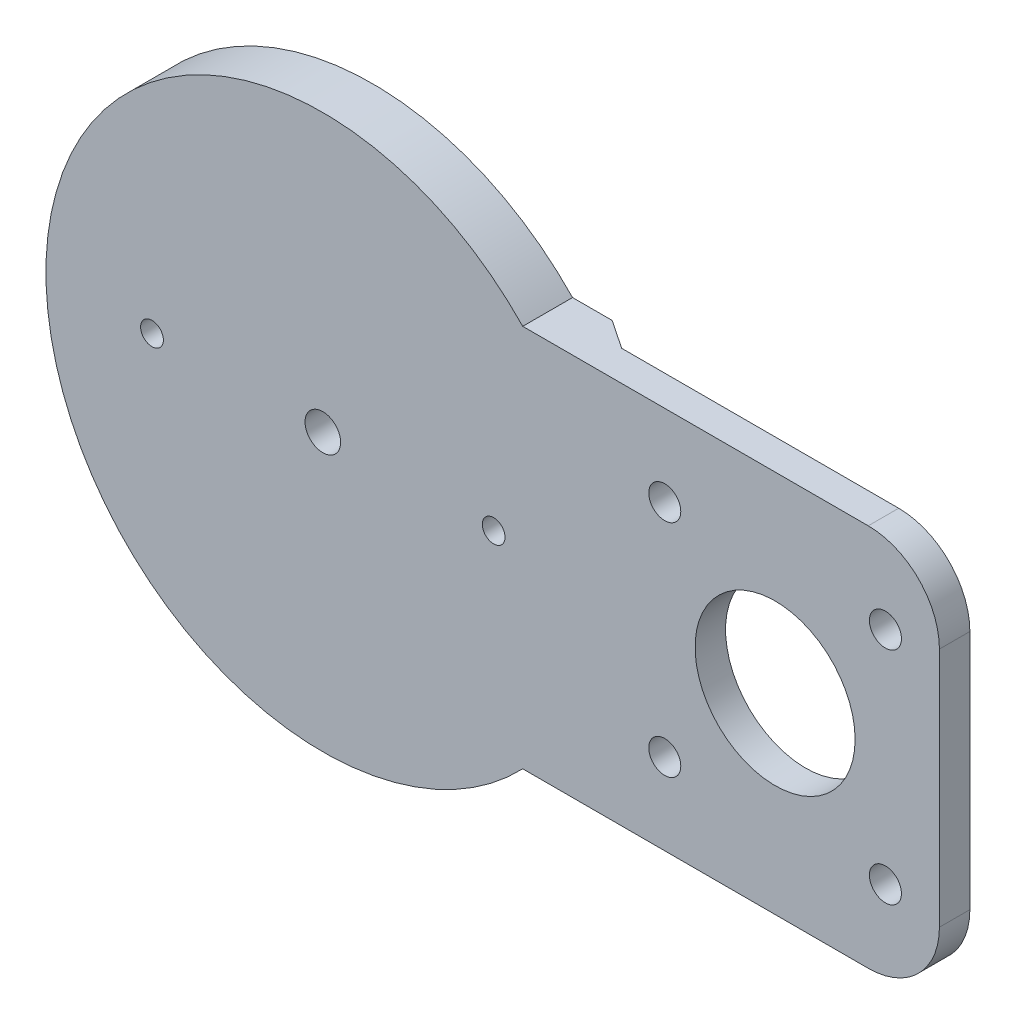
ISO-10303-21;
HEADER;
FILE_DESCRIPTION(('STEP AP214'),'2;1');
FILE_NAME('part.step','',(''),(''),'','','');
FILE_SCHEMA(('AUTOMOTIVE_DESIGN { 1 0 10303 214 1 1 1 1 }'));
ENDSEC;
DATA;
#1=APPLICATION_CONTEXT('core data for automotive mechanical design processes');
#2=APPLICATION_PROTOCOL_DEFINITION('international standard','automotive_design',2000,#1);
#3=PRODUCT_CONTEXT('',#1,'mechanical');
#4=PRODUCT('Part','Part','',(#3));
#5=PRODUCT_RELATED_PRODUCT_CATEGORY('part','',(#4));
#6=PRODUCT_DEFINITION_FORMATION('','',#4);
#7=PRODUCT_DEFINITION_CONTEXT('part definition',#1,'design');
#8=PRODUCT_DEFINITION('design','',#6,#7);
#9=PRODUCT_DEFINITION_SHAPE('','',#8);
#10=(LENGTH_UNIT() NAMED_UNIT(*) SI_UNIT(.MILLI.,.METRE.));
#11=(NAMED_UNIT(*) PLANE_ANGLE_UNIT() SI_UNIT($,.RADIAN.));
#12=(NAMED_UNIT(*) SI_UNIT($,.STERADIAN.) SOLID_ANGLE_UNIT());
#13=UNCERTAINTY_MEASURE_WITH_UNIT(LENGTH_MEASURE(1.E-05),#10,'distance_accuracy_value','');
#14=(GEOMETRIC_REPRESENTATION_CONTEXT(3) GLOBAL_UNCERTAINTY_ASSIGNED_CONTEXT((#13)) GLOBAL_UNIT_ASSIGNED_CONTEXT((#10,
#11,#12)) REPRESENTATION_CONTEXT('',''));
#15=CARTESIAN_POINT('',(0.,0.,0.));
#16=DIRECTION('',(0.,0.,1.));
#17=DIRECTION('',(1.,0.,0.));
#18=AXIS2_PLACEMENT_3D('',#15,#16,#17);
#19=CARTESIAN_POINT('',(0.,0.,0.));
#20=DIRECTION('',(0.,0.,-1.));
#21=DIRECTION('',(-1.,0.,0.));
#22=AXIS2_PLACEMENT_3D('',#19,#20,#21);
#23=PLANE('',#22);
#24=CARTESIAN_POINT('',(-24.,0.,0.));
#25=DIRECTION('',(0.,0.,-1.));
#26=DIRECTION('',(-1.,0.,0.));
#27=AXIS2_PLACEMENT_3D('',#24,#25,#26);
#28=CIRCLE('',#27,1.6);
#29=CARTESIAN_POINT('',(-25.6,0.,0.));
#30=VERTEX_POINT('',#29);
#31=EDGE_CURVE('E172',#30,#30,#28,.F.);
#32=ORIENTED_EDGE('',*,*,#31,.T.);
#33=EDGE_LOOP('',(#32));
#34=FACE_BOUND('',#33,.T.);
#35=CARTESIAN_POINT('',(0.,0.,0.));
#36=DIRECTION('',(0.,0.,-1.));
#37=DIRECTION('',(-1.,0.,0.));
#38=AXIS2_PLACEMENT_3D('',#35,#36,#37);
#39=CIRCLE('',#38,2.5);
#40=CARTESIAN_POINT('',(-2.5,0.,0.));
#41=VERTEX_POINT('',#40);
#42=EDGE_CURVE('E165',#41,#41,#39,.F.);
#43=ORIENTED_EDGE('',*,*,#42,.T.);
#44=EDGE_LOOP('',(#43));
#45=FACE_BOUND('',#44,.T.);
#46=CARTESIAN_POINT('',(24.,0.,0.));
#47=DIRECTION('',(0.,0.,-1.));
#48=DIRECTION('',(-1.,0.,0.));
#49=AXIS2_PLACEMENT_3D('',#46,#47,#48);
#50=CIRCLE('',#49,1.6);
#51=CARTESIAN_POINT('',(22.4,0.,0.));
#52=VERTEX_POINT('',#51);
#53=EDGE_CURVE('E158',#52,#52,#50,.F.);
#54=ORIENTED_EDGE('',*,*,#53,.T.);
#55=EDGE_LOOP('',(#54));
#56=FACE_BOUND('',#55,.T.);
#57=CARTESIAN_POINT('',(0.,0.,0.));
#58=DIRECTION('',(0.,0.,1.));
#59=DIRECTION('',(0.,1.,0.));
#60=AXIS2_PLACEMENT_3D('',#57,#58,#59);
#61=CIRCLE('',#60,27.5);
#62=CARTESIAN_POINT('',(0.,27.5,0.));
#63=VERTEX_POINT('',#62);
#64=EDGE_CURVE('E96',#63,#63,#61,.T.);
#65=ORIENTED_EDGE('',*,*,#64,.F.);
#66=EDGE_LOOP('',(#65));
#67=FACE_BOUND('',#66,.T.);
#68=ADVANCED_FACE('F18',(#34,#45,#56,#67),#23,.T.);
#69=CARTESIAN_POINT('',(37.7110314580561,120.933629388198,2.723));
#70=DIRECTION('',(-0.556254898737596,0.,0.831011725326681));
#71=DIRECTION('',(0.831011725326681,0.,0.556254898737596));
#72=AXIS2_PLACEMENT_3D('',#69,#70,#71);
#73=PLANE('',#72);
#74=CARTESIAN_POINT('',(0.,0.,-22.5196594543477));
#75=DIRECTION('',(-0.556254898737596,0.,0.831011725326681));
#76=DIRECTION('',(-0.831011725326681,0.,-0.556254898737596));
#77=AXIS2_PLACEMENT_3D('',#74,#75,#76);
#78=ELLIPSE('',#77,43.9223646160364,36.5);
#79=CARTESIAN_POINT('',(33.6430314580561,14.1561447545667,0.));
#80=VERTEX_POINT('',#79);
#81=CARTESIAN_POINT('',(33.6430314580561,-14.1561447545667,0.));
#82=VERTEX_POINT('',#81);
#83=EDGE_CURVE('E11',#80,#82,#78,.F.);
#84=ORIENTED_EDGE('',*,*,#83,.F.);
#85=DIRECTION('',(0.,-1.,0.));
#86=VECTOR('',#85,1.);
#87=CARTESIAN_POINT('',(33.6430314580561,120.933629388198,0.));
#88=LINE('',#87,#86);
#89=CARTESIAN_POINT('',(33.6430314580561,26.9205,0.));
#90=VERTEX_POINT('',#89);
#91=EDGE_CURVE('E94',#90,#80,#88,.T.);
#92=ORIENTED_EDGE('',*,*,#91,.F.);
#93=DIRECTION('',(0.831011725326681,0.,0.556254898737596));
#94=VECTOR('',#93,1.);
#95=CARTESIAN_POINT('',(33.0405655096556,26.9205,-0.403273052481443));
#96=LINE('',#95,#94);
#97=CARTESIAN_POINT('',(37.7110314580561,26.9205,2.723));
#98=VERTEX_POINT('',#97);
#99=EDGE_CURVE('E130',#90,#98,#96,.T.);
#100=ORIENTED_EDGE('',*,*,#99,.T.);
#101=DIRECTION('',(0.,-1.,0.));
#102=VECTOR('',#101,1.);
#103=CARTESIAN_POINT('',(37.7110314580561,120.933629388198,2.723));
#104=LINE('',#103,#102);
#105=CARTESIAN_POINT('',(37.7110314580561,-26.9205,2.723));
#106=VERTEX_POINT('',#105);
#107=EDGE_CURVE('E39',#98,#106,#104,.T.);
#108=ORIENTED_EDGE('',*,*,#107,.T.);
#109=DIRECTION('',(-0.831011725326681,0.,-0.556254898737596));
#110=VECTOR('',#109,1.);
#111=CARTESIAN_POINT('',(37.7110314580561,-26.9205,2.723));
#112=LINE('',#111,#110);
#113=CARTESIAN_POINT('',(33.6430314580561,-26.9205,0.));
#114=VERTEX_POINT('',#113);
#115=EDGE_CURVE('E100',#106,#114,#112,.T.);
#116=ORIENTED_EDGE('',*,*,#115,.T.);
#117=EDGE_CURVE('E91',#82,#114,#88,.T.);
#118=ORIENTED_EDGE('',*,*,#117,.F.);
#119=EDGE_LOOP('',(#84,#92,#100,#108,#116,#118));
#120=FACE_BOUND('',#119,.T.);
#121=ADVANCED_FACE('F98',(#120),#73,.F.);
#122=CARTESIAN_POINT('',(28.0850314580561,26.9205,7.));
#123=DIRECTION('',(0.,1.,0.));
#124=DIRECTION('',(0.,0.,1.));
#125=AXIS2_PLACEMENT_3D('',#122,#123,#124);
#126=PLANE('',#125);
#127=DIRECTION('',(1.,0.,0.));
#128=VECTOR('',#127,1.);
#129=CARTESIAN_POINT('',(28.0850314580561,26.9205,2.723));
#130=LINE('',#129,#128);
#131=CARTESIAN_POINT('',(76.6270314580561,26.9205,2.723));
#132=VERTEX_POINT('',#131);
#133=EDGE_CURVE('E126',#98,#132,#130,.T.);
#134=ORIENTED_EDGE('',*,*,#133,.F.);
#135=ORIENTED_EDGE('',*,*,#99,.F.);
#136=DIRECTION('',(1.,0.,0.));
#137=VECTOR('',#136,1.);
#138=CARTESIAN_POINT('',(28.0850314580561,26.9205,0.));
#139=LINE('',#138,#137);
#140=CARTESIAN_POINT('',(28.0850314580561,26.9205,0.));
#141=VERTEX_POINT('',#140);
#142=EDGE_CURVE('E175',#141,#90,#139,.T.);
#143=ORIENTED_EDGE('',*,*,#142,.F.);
#144=DIRECTION('',(0.,0.,-1.));
#145=VECTOR('',#144,1.);
#146=CARTESIAN_POINT('',(28.0850314580561,26.9205,7.));
#147=LINE('',#146,#145);
#148=CARTESIAN_POINT('',(28.0850314580561,26.9205,7.));
#149=VERTEX_POINT('',#148);
#150=EDGE_CURVE('E185',#149,#141,#147,.T.);
#151=ORIENTED_EDGE('',*,*,#150,.F.);
#152=DIRECTION('',(1.,0.,0.));
#153=VECTOR('',#152,1.);
#154=CARTESIAN_POINT('',(28.0850314580561,26.9205,7.));
#155=LINE('',#154,#153);
#156=CARTESIAN_POINT('',(76.6270314580561,26.9205,7.));
#157=VERTEX_POINT('',#156);
#158=EDGE_CURVE('E180',#149,#157,#155,.T.);
#159=ORIENTED_EDGE('',*,*,#158,.T.);
#160=DIRECTION('',(0.,0.,-1.));
#161=VECTOR('',#160,1.);
#162=CARTESIAN_POINT('',(76.6270314580561,26.9205,7.));
#163=LINE('',#162,#161);
#164=EDGE_CURVE('E26',#157,#132,#163,.T.);
#165=ORIENTED_EDGE('',*,*,#164,.T.);
#166=EDGE_LOOP('',(#134,#135,#143,#151,#159,#165));
#167=FACE_BOUND('',#166,.T.);
#168=ADVANCED_FACE('F215',(#167),#126,.T.);
#169=CARTESIAN_POINT('',(86.6270314580561,-26.9205,7.));
#170=DIRECTION('',(1.,0.,0.));
#171=DIRECTION('',(0.,1.,0.));
#172=AXIS2_PLACEMENT_3D('',#169,#170,#171);
#173=PLANE('',#172);
#174=DIRECTION('',(0.,-1.,0.));
#175=VECTOR('',#174,1.);
#176=CARTESIAN_POINT('',(86.6270314580561,120.933629388198,2.723));
#177=LINE('',#176,#175);
#178=CARTESIAN_POINT('',(86.6270314580561,16.9205,2.723));
#179=VERTEX_POINT('',#178);
#180=CARTESIAN_POINT('',(86.6270314580561,-16.9205,2.723));
#181=VERTEX_POINT('',#180);
#182=EDGE_CURVE('E109',#179,#181,#177,.T.);
#183=ORIENTED_EDGE('',*,*,#182,.F.);
#184=DIRECTION('',(0.,0.,-1.));
#185=VECTOR('',#184,1.);
#186=CARTESIAN_POINT('',(86.6270314580561,16.9205,7.));
#187=LINE('',#186,#185);
#188=CARTESIAN_POINT('',(86.6270314580561,16.9205,7.));
#189=VERTEX_POINT('',#188);
#190=EDGE_CURVE('E201',#179,#189,#187,.F.);
#191=ORIENTED_EDGE('',*,*,#190,.T.);
#192=DIRECTION('',(0.,-1.,0.));
#193=VECTOR('',#192,1.);
#194=CARTESIAN_POINT('',(86.6270314580561,26.9205,7.));
#195=LINE('',#194,#193);
#196=CARTESIAN_POINT('',(86.6270314580561,-16.9205,7.));
#197=VERTEX_POINT('',#196);
#198=EDGE_CURVE('E176',#189,#197,#195,.T.);
#199=ORIENTED_EDGE('',*,*,#198,.T.);
#200=DIRECTION('',(0.,0.,-1.));
#201=VECTOR('',#200,1.);
#202=CARTESIAN_POINT('',(86.6270314580561,-16.9205,7.));
#203=LINE('',#202,#201);
#204=EDGE_CURVE('E203',#197,#181,#203,.T.);
#205=ORIENTED_EDGE('',*,*,#204,.T.);
#206=EDGE_LOOP('',(#183,#191,#199,#205));
#207=FACE_BOUND('',#206,.T.);
#208=ADVANCED_FACE('F227',(#207),#173,.T.);
#209=CARTESIAN_POINT('',(28.0850314580561,-26.9205,7.));
#210=DIRECTION('',(0.,-1.,0.));
#211=DIRECTION('',(1.,0.,0.));
#212=AXIS2_PLACEMENT_3D('',#209,#210,#211);
#213=PLANE('',#212);
#214=DIRECTION('',(-1.,0.,0.));
#215=VECTOR('',#214,1.);
#216=CARTESIAN_POINT('',(86.6270314580561,-26.9205,2.723));
#217=LINE('',#216,#215);
#218=CARTESIAN_POINT('',(76.6270314580561,-26.9205,2.723));
#219=VERTEX_POINT('',#218);
#220=EDGE_CURVE('E104',#219,#106,#217,.T.);
#221=ORIENTED_EDGE('',*,*,#220,.F.);
#222=DIRECTION('',(0.,0.,-1.));
#223=VECTOR('',#222,1.);
#224=CARTESIAN_POINT('',(76.6270314580561,-26.9205,7.));
#225=LINE('',#224,#223);
#226=CARTESIAN_POINT('',(76.6270314580561,-26.9205,7.));
#227=VERTEX_POINT('',#226);
#228=EDGE_CURVE('E206',#219,#227,#225,.F.);
#229=ORIENTED_EDGE('',*,*,#228,.T.);
#230=DIRECTION('',(-1.,0.,0.));
#231=VECTOR('',#230,1.);
#232=CARTESIAN_POINT('',(28.0850314580561,-26.9205,7.));
#233=LINE('',#232,#231);
#234=CARTESIAN_POINT('',(28.0850314580561,-26.9205,7.));
#235=VERTEX_POINT('',#234);
#236=EDGE_CURVE('E179',#227,#235,#233,.T.);
#237=ORIENTED_EDGE('',*,*,#236,.T.);
#238=DIRECTION('',(0.,0.,-1.));
#239=VECTOR('',#238,1.);
#240=CARTESIAN_POINT('',(28.0850314580561,-26.9205,7.));
#241=LINE('',#240,#239);
#242=CARTESIAN_POINT('',(28.0850314580561,-26.9205,0.));
#243=VERTEX_POINT('',#242);
#244=EDGE_CURVE('E198',#235,#243,#241,.T.);
#245=ORIENTED_EDGE('',*,*,#244,.T.);
#246=DIRECTION('',(-1.,0.,0.));
#247=VECTOR('',#246,1.);
#248=CARTESIAN_POINT('',(28.0850314580561,-26.9205,0.));
#249=LINE('',#248,#247);
#250=EDGE_CURVE('E189',#114,#243,#249,.T.);
#251=ORIENTED_EDGE('',*,*,#250,.F.);
#252=ORIENTED_EDGE('',*,*,#115,.F.);
#253=EDGE_LOOP('',(#221,#229,#237,#245,#251,#252));
#254=FACE_BOUND('',#253,.T.);
#255=ADVANCED_FACE('F236',(#254),#213,.T.);
#256=CARTESIAN_POINT('',(0.,0.,7.));
#257=DIRECTION('',(0.,0.,-1.));
#258=DIRECTION('',(-1.,0.,0.));
#259=AXIS2_PLACEMENT_3D('',#256,#257,#258);
#260=CYLINDRICAL_SURFACE('',#259,38.9035);
#261=CARTESIAN_POINT('',(0.,0.,0.));
#262=DIRECTION('',(0.,0.,-1.));
#263=DIRECTION('',(1.,0.,0.));
#264=AXIS2_PLACEMENT_3D('',#261,#262,#263);
#265=CIRCLE('',#264,38.9035);
#266=EDGE_CURVE('E188',#243,#141,#265,.T.);
#267=ORIENTED_EDGE('',*,*,#266,.F.);
#268=ORIENTED_EDGE('',*,*,#244,.F.);
#269=CARTESIAN_POINT('',(0.,0.,7.));
#270=DIRECTION('',(0.,0.,-1.));
#271=DIRECTION('',(1.,0.,0.));
#272=AXIS2_PLACEMENT_3D('',#269,#270,#271);
#273=CIRCLE('',#272,38.9035);
#274=EDGE_CURVE('E182',#235,#149,#273,.T.);
#275=ORIENTED_EDGE('',*,*,#274,.T.);
#276=ORIENTED_EDGE('',*,*,#150,.T.);
#277=EDGE_LOOP('',(#267,#268,#275,#276));
#278=FACE_BOUND('',#277,.T.);
#279=ADVANCED_FACE('F283',(#278),#260,.T.);
#280=CARTESIAN_POINT('',(0.,0.,7.));
#281=DIRECTION('',(0.,0.,-1.));
#282=DIRECTION('',(-1.,0.,0.));
#283=AXIS2_PLACEMENT_3D('',#280,#281,#282);
#284=PLANE('',#283);
#285=CARTESIAN_POINT('',(79.0390314580561,15.5,7.));
#286=DIRECTION('',(0.,0.,-1.));
#287=DIRECTION('',(1.,0.,0.));
#288=AXIS2_PLACEMENT_3D('',#285,#286,#287);
#289=CIRCLE('',#288,2.25);
#290=CARTESIAN_POINT('',(81.2890314580561,15.5,7.));
#291=VERTEX_POINT('',#290);
#292=EDGE_CURVE('E132',#291,#291,#289,.T.);
#293=ORIENTED_EDGE('',*,*,#292,.T.);
#294=EDGE_LOOP('',(#293));
#295=FACE_BOUND('',#294,.T.);
#296=CARTESIAN_POINT('',(79.0390314580561,-15.5,7.));
#297=DIRECTION('',(0.,0.,-1.));
#298=DIRECTION('',(1.,0.,0.));
#299=AXIS2_PLACEMENT_3D('',#296,#297,#298);
#300=CIRCLE('',#299,2.25);
#301=CARTESIAN_POINT('',(81.2890314580561,-15.5,7.));
#302=VERTEX_POINT('',#301);
#303=EDGE_CURVE('E138',#302,#302,#300,.T.);
#304=ORIENTED_EDGE('',*,*,#303,.T.);
#305=EDGE_LOOP('',(#304));
#306=FACE_BOUND('',#305,.T.);
#307=CARTESIAN_POINT('',(63.5410314580561,0.,7.));
#308=DIRECTION('',(0.,0.,-1.));
#309=DIRECTION('',(1.,0.,0.));
#310=AXIS2_PLACEMENT_3D('',#307,#308,#309);
#311=CIRCLE('',#310,11.24);
#312=CARTESIAN_POINT('',(74.7810314580561,0.,7.));
#313=VERTEX_POINT('',#312);
#314=EDGE_CURVE('E142',#313,#313,#311,.T.);
#315=ORIENTED_EDGE('',*,*,#314,.T.);
#316=EDGE_LOOP('',(#315));
#317=FACE_BOUND('',#316,.T.);
#318=CARTESIAN_POINT('',(48.0390314580561,-15.5,7.));
#319=DIRECTION('',(0.,0.,-1.));
#320=DIRECTION('',(1.,0.,0.));
#321=AXIS2_PLACEMENT_3D('',#318,#319,#320);
#322=CIRCLE('',#321,2.25);
#323=CARTESIAN_POINT('',(50.2890314580561,-15.5,7.));
#324=VERTEX_POINT('',#323);
#325=EDGE_CURVE('E146',#324,#324,#322,.T.);
#326=ORIENTED_EDGE('',*,*,#325,.T.);
#327=EDGE_LOOP('',(#326));
#328=FACE_BOUND('',#327,.T.);
#329=CARTESIAN_POINT('',(48.0390314580561,15.5,7.));
#330=DIRECTION('',(0.,0.,-1.));
#331=DIRECTION('',(1.,0.,0.));
#332=AXIS2_PLACEMENT_3D('',#329,#330,#331);
#333=CIRCLE('',#332,2.25);
#334=CARTESIAN_POINT('',(50.2890314580561,15.5,7.));
#335=VERTEX_POINT('',#334);
#336=EDGE_CURVE('E150',#335,#335,#333,.T.);
#337=ORIENTED_EDGE('',*,*,#336,.T.);
#338=EDGE_LOOP('',(#337));
#339=FACE_BOUND('',#338,.T.);
#340=CARTESIAN_POINT('',(24.,0.,7.));
#341=DIRECTION('',(0.,0.,-1.));
#342=DIRECTION('',(1.,0.,0.));
#343=AXIS2_PLACEMENT_3D('',#340,#341,#342);
#344=CIRCLE('',#343,1.6);
#345=CARTESIAN_POINT('',(25.6,0.,7.));
#346=VERTEX_POINT('',#345);
#347=EDGE_CURVE('E154',#346,#346,#344,.T.);
#348=ORIENTED_EDGE('',*,*,#347,.T.);
#349=EDGE_LOOP('',(#348));
#350=FACE_BOUND('',#349,.T.);
#351=CARTESIAN_POINT('',(0.,0.,7.));
#352=DIRECTION('',(0.,0.,-1.));
#353=DIRECTION('',(1.,0.,0.));
#354=AXIS2_PLACEMENT_3D('',#351,#352,#353);
#355=CIRCLE('',#354,2.5);
#356=CARTESIAN_POINT('',(2.5,0.,7.));
#357=VERTEX_POINT('',#356);
#358=EDGE_CURVE('E161',#357,#357,#355,.T.);
#359=ORIENTED_EDGE('',*,*,#358,.T.);
#360=EDGE_LOOP('',(#359));
#361=FACE_BOUND('',#360,.T.);
#362=CARTESIAN_POINT('',(-24.,0.,7.));
#363=DIRECTION('',(0.,0.,-1.));
#364=DIRECTION('',(1.,0.,0.));
#365=AXIS2_PLACEMENT_3D('',#362,#363,#364);
#366=CIRCLE('',#365,1.6);
#367=CARTESIAN_POINT('',(-22.4,0.,7.));
#368=VERTEX_POINT('',#367);
#369=EDGE_CURVE('E168',#368,#368,#366,.T.);
#370=ORIENTED_EDGE('',*,*,#369,.T.);
#371=EDGE_LOOP('',(#370));
#372=FACE_BOUND('',#371,.T.);
#373=ORIENTED_EDGE('',*,*,#236,.F.);
#374=CARTESIAN_POINT('',(76.6270314580561,-16.9205,7.));
#375=DIRECTION('',(0.,0.,-1.));
#376=DIRECTION('',(-1.,0.,0.));
#377=AXIS2_PLACEMENT_3D('',#374,#375,#376);
#378=CIRCLE('',#377,10.);
#379=EDGE_CURVE('E210',#227,#197,#378,.F.);
#380=ORIENTED_EDGE('',*,*,#379,.T.);
#381=ORIENTED_EDGE('',*,*,#198,.F.);
#382=CARTESIAN_POINT('',(76.6270314580561,16.9205,7.));
#383=DIRECTION('',(0.,0.,-1.));
#384=DIRECTION('',(-1.,0.,0.));
#385=AXIS2_PLACEMENT_3D('',#382,#383,#384);
#386=CIRCLE('',#385,10.);
#387=EDGE_CURVE('E208',#189,#157,#386,.F.);
#388=ORIENTED_EDGE('',*,*,#387,.T.);
#389=ORIENTED_EDGE('',*,*,#158,.F.);
#390=ORIENTED_EDGE('',*,*,#274,.F.);
#391=EDGE_LOOP('',(#373,#380,#381,#388,#389,#390));
#392=FACE_BOUND('',#391,.T.);
#393=ADVANCED_FACE('F277',(#295,#306,#317,#328,#339,#350,#361,#372,#392),#284,.F.);
#394=ORIENTED_EDGE('',*,*,#91,.T.);
#395=CARTESIAN_POINT('',(0.,0.,0.));
#396=DIRECTION('',(0.,0.,1.));
#397=DIRECTION('',(1.,0.,0.));
#398=AXIS2_PLACEMENT_3D('',#395,#396,#397);
#399=CIRCLE('',#398,36.5);
#400=EDGE_CURVE('E31',#80,#82,#399,.T.);
#401=ORIENTED_EDGE('',*,*,#400,.T.);
#402=ORIENTED_EDGE('',*,*,#117,.T.);
#403=ORIENTED_EDGE('',*,*,#250,.T.);
#404=ORIENTED_EDGE('',*,*,#266,.T.);
#405=ORIENTED_EDGE('',*,*,#142,.T.);
#406=EDGE_LOOP('',(#394,#401,#402,#403,#404,#405));
#407=FACE_BOUND('',#406,.T.);
#408=ADVANCED_FACE('F90',(#407),#23,.T.);
#409=CARTESIAN_POINT('',(76.6270314580561,-16.9205,7.));
#410=DIRECTION('',(0.,0.,-1.));
#411=DIRECTION('',(-1.,0.,0.));
#412=AXIS2_PLACEMENT_3D('',#409,#410,#411);
#413=CYLINDRICAL_SURFACE('',#412,10.);
#414=CARTESIAN_POINT('',(76.6270314580561,-16.9205,2.723));
#415=DIRECTION('',(0.,0.,1.));
#416=DIRECTION('',(1.,0.,0.));
#417=AXIS2_PLACEMENT_3D('',#414,#415,#416);
#418=CIRCLE('',#417,10.);
#419=EDGE_CURVE('E128',#181,#219,#418,.F.);
#420=ORIENTED_EDGE('',*,*,#419,.F.);
#421=ORIENTED_EDGE('',*,*,#204,.F.);
#422=ORIENTED_EDGE('',*,*,#379,.F.);
#423=ORIENTED_EDGE('',*,*,#228,.F.);
#424=EDGE_LOOP('',(#420,#421,#422,#423));
#425=FACE_BOUND('',#424,.T.);
#426=ADVANCED_FACE('F232',(#425),#413,.T.);
#427=CARTESIAN_POINT('',(76.6270314580561,16.9205,7.));
#428=DIRECTION('',(0.,0.,-1.));
#429=DIRECTION('',(-1.,0.,0.));
#430=AXIS2_PLACEMENT_3D('',#427,#428,#429);
#431=CYLINDRICAL_SURFACE('',#430,10.);
#432=CARTESIAN_POINT('',(76.6270314580561,16.9205,2.723));
#433=DIRECTION('',(0.,0.,1.));
#434=DIRECTION('',(1.,0.,0.));
#435=AXIS2_PLACEMENT_3D('',#432,#433,#434);
#436=CIRCLE('',#435,10.);
#437=EDGE_CURVE('E124',#132,#179,#436,.F.);
#438=ORIENTED_EDGE('',*,*,#437,.F.);
#439=ORIENTED_EDGE('',*,*,#164,.F.);
#440=ORIENTED_EDGE('',*,*,#387,.F.);
#441=ORIENTED_EDGE('',*,*,#190,.F.);
#442=EDGE_LOOP('',(#438,#439,#440,#441));
#443=FACE_BOUND('',#442,.T.);
#444=ADVANCED_FACE('F20',(#443),#431,.T.);
#445=CARTESIAN_POINT('',(-24.,0.,-140.854129388198));
#446=DIRECTION('',(0.,0.,1.));
#447=DIRECTION('',(1.,0.,0.));
#448=AXIS2_PLACEMENT_3D('',#445,#446,#447);
#449=CYLINDRICAL_SURFACE('',#448,1.6);
#450=ORIENTED_EDGE('',*,*,#369,.F.);
#451=EDGE_LOOP('',(#450));
#452=FACE_BOUND('',#451,.T.);
#453=ORIENTED_EDGE('',*,*,#31,.F.);
#454=EDGE_LOOP('',(#453));
#455=FACE_BOUND('',#454,.T.);
#456=ADVANCED_FACE('F292',(#452,#455),#449,.F.);
#457=CARTESIAN_POINT('',(0.,0.,-140.854129388198));
#458=DIRECTION('',(0.,0.,1.));
#459=DIRECTION('',(1.,0.,0.));
#460=AXIS2_PLACEMENT_3D('',#457,#458,#459);
#461=CYLINDRICAL_SURFACE('',#460,2.5);
#462=ORIENTED_EDGE('',*,*,#358,.F.);
#463=EDGE_LOOP('',(#462));
#464=FACE_BOUND('',#463,.T.);
#465=ORIENTED_EDGE('',*,*,#42,.F.);
#466=EDGE_LOOP('',(#465));
#467=FACE_BOUND('',#466,.T.);
#468=ADVANCED_FACE('F295',(#464,#467),#461,.F.);
#469=CARTESIAN_POINT('',(24.,0.,-140.854129388198));
#470=DIRECTION('',(0.,0.,1.));
#471=DIRECTION('',(1.,0.,0.));
#472=AXIS2_PLACEMENT_3D('',#469,#470,#471);
#473=CYLINDRICAL_SURFACE('',#472,1.6);
#474=ORIENTED_EDGE('',*,*,#347,.F.);
#475=EDGE_LOOP('',(#474));
#476=FACE_BOUND('',#475,.T.);
#477=ORIENTED_EDGE('',*,*,#53,.F.);
#478=EDGE_LOOP('',(#477));
#479=FACE_BOUND('',#478,.T.);
#480=ADVANCED_FACE('F299',(#476,#479),#473,.F.);
#481=CARTESIAN_POINT('',(48.0390314580561,15.5,-140.854129388198));
#482=DIRECTION('',(0.,0.,1.));
#483=DIRECTION('',(1.,0.,0.));
#484=AXIS2_PLACEMENT_3D('',#481,#482,#483);
#485=CYLINDRICAL_SURFACE('',#484,2.25);
#486=CARTESIAN_POINT('',(48.0390314580561,15.5,2.723));
#487=DIRECTION('',(0.,0.,1.));
#488=DIRECTION('',(1.,0.,0.));
#489=AXIS2_PLACEMENT_3D('',#486,#487,#488);
#490=CIRCLE('',#489,2.25);
#491=CARTESIAN_POINT('',(50.2890314580561,15.5,2.723));
#492=VERTEX_POINT('',#491);
#493=EDGE_CURVE('E121',#492,#492,#490,.T.);
#494=ORIENTED_EDGE('',*,*,#493,.F.);
#495=EDGE_LOOP('',(#494));
#496=FACE_BOUND('',#495,.T.);
#497=ORIENTED_EDGE('',*,*,#336,.F.);
#498=EDGE_LOOP('',(#497));
#499=FACE_BOUND('',#498,.T.);
#500=ADVANCED_FACE('F303',(#496,#499),#485,.F.);
#501=CARTESIAN_POINT('',(48.0390314580561,-15.5,-140.854129388198));
#502=DIRECTION('',(0.,0.,1.));
#503=DIRECTION('',(1.,0.,0.));
#504=AXIS2_PLACEMENT_3D('',#501,#502,#503);
#505=CYLINDRICAL_SURFACE('',#504,2.25);
#506=CARTESIAN_POINT('',(48.0390314580561,-15.5,2.723));
#507=DIRECTION('',(0.,0.,1.));
#508=DIRECTION('',(1.,0.,0.));
#509=AXIS2_PLACEMENT_3D('',#506,#507,#508);
#510=CIRCLE('',#509,2.25);
#511=CARTESIAN_POINT('',(50.2890314580561,-15.5,2.723));
#512=VERTEX_POINT('',#511);
#513=EDGE_CURVE('E118',#512,#512,#510,.T.);
#514=ORIENTED_EDGE('',*,*,#513,.F.);
#515=EDGE_LOOP('',(#514));
#516=FACE_BOUND('',#515,.T.);
#517=ORIENTED_EDGE('',*,*,#325,.F.);
#518=EDGE_LOOP('',(#517));
#519=FACE_BOUND('',#518,.T.);
#520=ADVANCED_FACE('F307',(#516,#519),#505,.F.);
#521=CARTESIAN_POINT('',(63.5410314580561,0.,-140.854129388198));
#522=DIRECTION('',(0.,0.,1.));
#523=DIRECTION('',(1.,0.,0.));
#524=AXIS2_PLACEMENT_3D('',#521,#522,#523);
#525=CYLINDRICAL_SURFACE('',#524,11.24);
#526=CARTESIAN_POINT('',(63.5410314580561,0.,2.723));
#527=DIRECTION('',(0.,0.,1.));
#528=DIRECTION('',(1.,0.,0.));
#529=AXIS2_PLACEMENT_3D('',#526,#527,#528);
#530=CIRCLE('',#529,11.24);
#531=CARTESIAN_POINT('',(74.7810314580561,0.,2.723));
#532=VERTEX_POINT('',#531);
#533=EDGE_CURVE('E115',#532,#532,#530,.T.);
#534=ORIENTED_EDGE('',*,*,#533,.F.);
#535=EDGE_LOOP('',(#534));
#536=FACE_BOUND('',#535,.T.);
#537=ORIENTED_EDGE('',*,*,#314,.F.);
#538=EDGE_LOOP('',(#537));
#539=FACE_BOUND('',#538,.T.);
#540=ADVANCED_FACE('F311',(#536,#539),#525,.F.);
#541=CARTESIAN_POINT('',(79.0390314580561,-15.5,-140.854129388198));
#542=DIRECTION('',(0.,0.,1.));
#543=DIRECTION('',(1.,0.,0.));
#544=AXIS2_PLACEMENT_3D('',#541,#542,#543);
#545=CYLINDRICAL_SURFACE('',#544,2.25);
#546=CARTESIAN_POINT('',(79.0390314580561,-15.5,2.723));
#547=DIRECTION('',(0.,0.,1.));
#548=DIRECTION('',(1.,0.,0.));
#549=AXIS2_PLACEMENT_3D('',#546,#547,#548);
#550=CIRCLE('',#549,2.25);
#551=CARTESIAN_POINT('',(81.2890314580561,-15.5,2.723));
#552=VERTEX_POINT('',#551);
#553=EDGE_CURVE('E112',#552,#552,#550,.T.);
#554=ORIENTED_EDGE('',*,*,#553,.F.);
#555=EDGE_LOOP('',(#554));
#556=FACE_BOUND('',#555,.T.);
#557=ORIENTED_EDGE('',*,*,#303,.F.);
#558=EDGE_LOOP('',(#557));
#559=FACE_BOUND('',#558,.T.);
#560=ADVANCED_FACE('F315',(#556,#559),#545,.F.);
#561=CARTESIAN_POINT('',(79.0390314580561,15.5,-140.854129388198));
#562=DIRECTION('',(0.,0.,1.));
#563=DIRECTION('',(1.,0.,0.));
#564=AXIS2_PLACEMENT_3D('',#561,#562,#563);
#565=CYLINDRICAL_SURFACE('',#564,2.25);
#566=CARTESIAN_POINT('',(79.0390314580561,15.5,2.723));
#567=DIRECTION('',(0.,0.,1.));
#568=DIRECTION('',(1.,0.,0.));
#569=AXIS2_PLACEMENT_3D('',#566,#567,#568);
#570=CIRCLE('',#569,2.25);
#571=CARTESIAN_POINT('',(81.2890314580561,15.5,2.723));
#572=VERTEX_POINT('',#571);
#573=EDGE_CURVE('E111',#572,#572,#570,.T.);
#574=ORIENTED_EDGE('',*,*,#573,.F.);
#575=EDGE_LOOP('',(#574));
#576=FACE_BOUND('',#575,.T.);
#577=ORIENTED_EDGE('',*,*,#292,.F.);
#578=EDGE_LOOP('',(#577));
#579=FACE_BOUND('',#578,.T.);
#580=ADVANCED_FACE('F319',(#576,#579),#565,.F.);
#581=CARTESIAN_POINT('',(86.6270314580561,120.933629388198,2.723));
#582=DIRECTION('',(0.,0.,1.));
#583=DIRECTION('',(1.,0.,0.));
#584=AXIS2_PLACEMENT_3D('',#581,#582,#583);
#585=PLANE('',#584);
#586=ORIENTED_EDGE('',*,*,#419,.T.);
#587=ORIENTED_EDGE('',*,*,#220,.T.);
#588=ORIENTED_EDGE('',*,*,#107,.F.);
#589=ORIENTED_EDGE('',*,*,#133,.T.);
#590=ORIENTED_EDGE('',*,*,#437,.T.);
#591=ORIENTED_EDGE('',*,*,#182,.T.);
#592=EDGE_LOOP('',(#586,#587,#588,#589,#590,#591));
#593=FACE_BOUND('',#592,.T.);
#594=ORIENTED_EDGE('',*,*,#493,.T.);
#595=EDGE_LOOP('',(#594));
#596=FACE_BOUND('',#595,.T.);
#597=ORIENTED_EDGE('',*,*,#513,.T.);
#598=EDGE_LOOP('',(#597));
#599=FACE_BOUND('',#598,.T.);
#600=ORIENTED_EDGE('',*,*,#533,.T.);
#601=EDGE_LOOP('',(#600));
#602=FACE_BOUND('',#601,.T.);
#603=ORIENTED_EDGE('',*,*,#553,.T.);
#604=EDGE_LOOP('',(#603));
#605=FACE_BOUND('',#604,.T.);
#606=ORIENTED_EDGE('',*,*,#573,.T.);
#607=EDGE_LOOP('',(#606));
#608=FACE_BOUND('',#607,.T.);
#609=ADVANCED_FACE('F223',(#593,#596,#599,#602,#605,#608),#585,.F.);
#610=CARTESIAN_POINT('',(0.,0.,2.5));
#611=DIRECTION('',(0.,0.,-1.));
#612=DIRECTION('',(-1.,0.,0.));
#613=AXIS2_PLACEMENT_3D('',#610,#611,#612);
#614=CYLINDRICAL_SURFACE('',#613,36.5);
#615=CARTESIAN_POINT('',(0.,0.,2.5));
#616=DIRECTION('',(0.,0.,1.));
#617=DIRECTION('',(1.,0.,0.));
#618=AXIS2_PLACEMENT_3D('',#615,#616,#617);
#619=CIRCLE('',#618,36.5);
#620=CARTESIAN_POINT('',(36.5,0.,2.5));
#621=VERTEX_POINT('',#620);
#622=EDGE_CURVE('E243',#621,#621,#619,.T.);
#623=ORIENTED_EDGE('',*,*,#622,.T.);
#624=EDGE_LOOP('',(#623));
#625=FACE_BOUND('',#624,.T.);
#626=ORIENTED_EDGE('',*,*,#83,.T.);
#627=ORIENTED_EDGE('',*,*,#400,.F.);
#628=EDGE_LOOP('',(#626,#627));
#629=FACE_BOUND('',#628,.T.);
#630=ADVANCED_FACE('F85',(#625,#629),#614,.F.);
#631=CARTESIAN_POINT('',(0.,0.,2.5));
#632=DIRECTION('',(0.,0.,-1.));
#633=DIRECTION('',(-1.,0.,0.));
#634=AXIS2_PLACEMENT_3D('',#631,#632,#633);
#635=CYLINDRICAL_SURFACE('',#634,27.5);
#636=CARTESIAN_POINT('',(0.,0.,2.5));
#637=DIRECTION('',(0.,0.,1.));
#638=DIRECTION('',(0.,1.,0.));
#639=AXIS2_PLACEMENT_3D('',#636,#637,#638);
#640=CIRCLE('',#639,27.5);
#641=CARTESIAN_POINT('',(0.,27.5,2.5));
#642=VERTEX_POINT('',#641);
#643=EDGE_CURVE('E239',#642,#642,#640,.T.);
#644=ORIENTED_EDGE('',*,*,#643,.F.);
#645=EDGE_LOOP('',(#644));
#646=FACE_BOUND('',#645,.T.);
#647=ORIENTED_EDGE('',*,*,#64,.T.);
#648=EDGE_LOOP('',(#647));
#649=FACE_BOUND('',#648,.T.);
#650=ADVANCED_FACE('F255',(#646,#649),#635,.T.);
#651=CARTESIAN_POINT('',(0.,0.,2.5));
#652=DIRECTION('',(0.,0.,1.));
#653=DIRECTION('',(1.,0.,0.));
#654=AXIS2_PLACEMENT_3D('',#651,#652,#653);
#655=PLANE('',#654);
#656=ORIENTED_EDGE('',*,*,#643,.T.);
#657=EDGE_LOOP('',(#656));
#658=FACE_BOUND('',#657,.T.);
#659=ORIENTED_EDGE('',*,*,#622,.F.);
#660=EDGE_LOOP('',(#659));
#661=FACE_BOUND('',#660,.T.);
#662=ADVANCED_FACE('F253',(#658,#661),#655,.F.);
#663=CLOSED_SHELL('',(#68,#121,#168,#208,#255,#279,#393,#408,#426,#444,#456,#468,#480,#500,#520,
#540,#560,#580,#609,#630,#650,#662));
#664=MANIFOLD_SOLID_BREP('B1',#663);
#665=ADVANCED_BREP_SHAPE_REPRESENTATION('',(#18,#664),#14);
#666=SHAPE_DEFINITION_REPRESENTATION(#9,#665);
ENDSEC;
END-ISO-10303-21;
